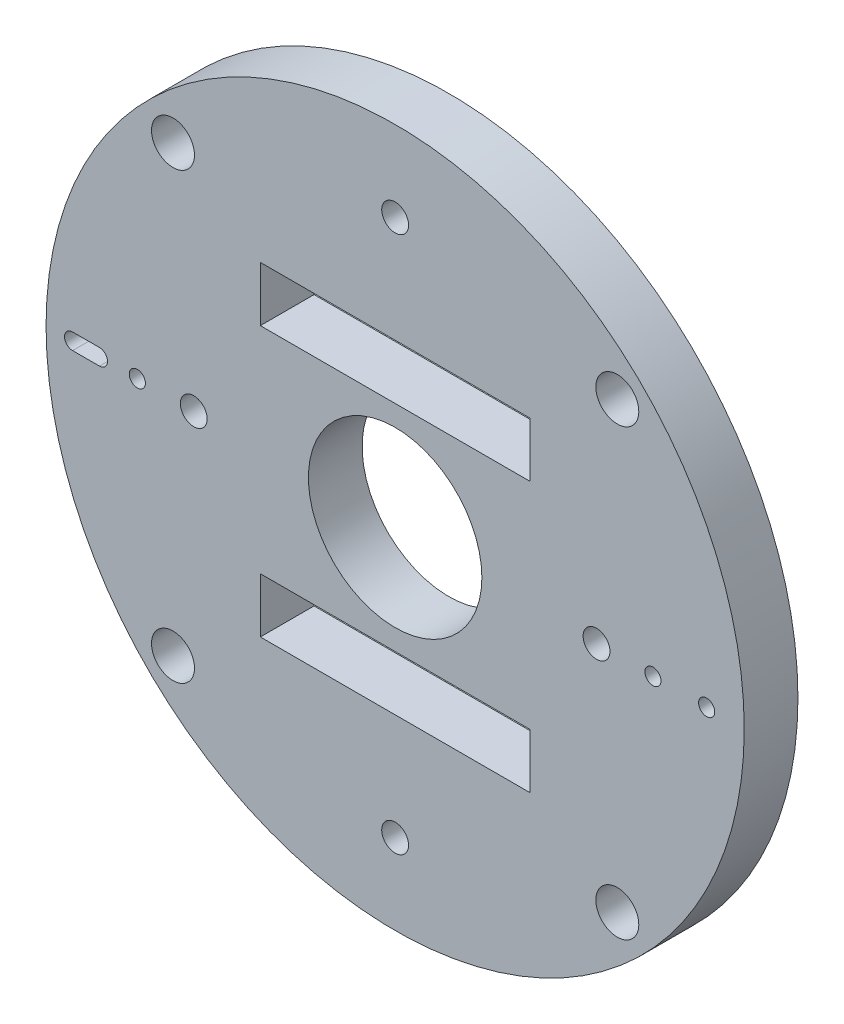
ISO-10303-21;
HEADER;
FILE_DESCRIPTION(('STEP AP214'),'2;1');
FILE_NAME('part.step','',(''),(''),'','','');
FILE_SCHEMA(('AUTOMOTIVE_DESIGN { 1 0 10303 214 1 1 1 1 }'));
ENDSEC;
DATA;
#1=APPLICATION_CONTEXT('core data for automotive mechanical design processes');
#2=APPLICATION_PROTOCOL_DEFINITION('international standard','automotive_design',2000,#1);
#3=PRODUCT_CONTEXT('',#1,'mechanical');
#4=PRODUCT('Part','Part','',(#3));
#5=PRODUCT_RELATED_PRODUCT_CATEGORY('part','',(#4));
#6=PRODUCT_DEFINITION_FORMATION('','',#4);
#7=PRODUCT_DEFINITION_CONTEXT('part definition',#1,'design');
#8=PRODUCT_DEFINITION('design','',#6,#7);
#9=PRODUCT_DEFINITION_SHAPE('','',#8);
#10=(LENGTH_UNIT() NAMED_UNIT(*) SI_UNIT(.MILLI.,.METRE.));
#11=(NAMED_UNIT(*) PLANE_ANGLE_UNIT() SI_UNIT($,.RADIAN.));
#12=(NAMED_UNIT(*) SI_UNIT($,.STERADIAN.) SOLID_ANGLE_UNIT());
#13=UNCERTAINTY_MEASURE_WITH_UNIT(LENGTH_MEASURE(1.E-05),#10,'distance_accuracy_value','');
#14=(GEOMETRIC_REPRESENTATION_CONTEXT(3) GLOBAL_UNCERTAINTY_ASSIGNED_CONTEXT((#13)) GLOBAL_UNIT_ASSIGNED_CONTEXT((#10,
#11,#12)) REPRESENTATION_CONTEXT('',''));
#15=CARTESIAN_POINT('',(0.,0.,0.));
#16=DIRECTION('',(0.,0.,1.));
#17=DIRECTION('',(1.,0.,0.));
#18=AXIS2_PLACEMENT_3D('',#15,#16,#17);
#19=CARTESIAN_POINT('',(0.,0.,10.));
#20=DIRECTION('',(0.,0.,1.));
#21=DIRECTION('',(1.,0.,0.));
#22=AXIS2_PLACEMENT_3D('',#19,#20,#21);
#23=PLANE('',#22);
#24=CARTESIAN_POINT('',(41.3657466994135,41.3657466994125,10.));
#25=DIRECTION('',(0.,0.,1.));
#26=DIRECTION('',(1.,0.,0.));
#27=AXIS2_PLACEMENT_3D('',#24,#25,#26);
#28=CIRCLE('',#27,4.00000000000001);
#29=CARTESIAN_POINT('',(45.3657466994135,41.3657466994125,10.));
#30=VERTEX_POINT('',#29);
#31=EDGE_CURVE('E168',#30,#30,#28,.T.);
#32=ORIENTED_EDGE('',*,*,#31,.F.);
#33=EDGE_LOOP('',(#32));
#34=FACE_BOUND('',#33,.T.);
#35=CARTESIAN_POINT('',(-41.3657466994132,41.3657466994128,10.));
#36=DIRECTION('',(0.,0.,1.));
#37=DIRECTION('',(1.,0.,0.));
#38=AXIS2_PLACEMENT_3D('',#35,#36,#37);
#39=CIRCLE('',#38,4.00000000000001);
#40=CARTESIAN_POINT('',(-37.3657466994132,41.3657466994128,10.));
#41=VERTEX_POINT('',#40);
#42=EDGE_CURVE('E180',#41,#41,#39,.T.);
#43=ORIENTED_EDGE('',*,*,#42,.F.);
#44=EDGE_LOOP('',(#43));
#45=FACE_BOUND('',#44,.T.);
#46=CARTESIAN_POINT('',(-48.,0.,10.));
#47=DIRECTION('',(0.,0.,1.));
#48=DIRECTION('',(1.,0.,0.));
#49=AXIS2_PLACEMENT_3D('',#46,#47,#48);
#50=CIRCLE('',#49,1.5);
#51=CARTESIAN_POINT('',(-46.5,0.,10.));
#52=VERTEX_POINT('',#51);
#53=EDGE_CURVE('E254',#52,#52,#50,.T.);
#54=ORIENTED_EDGE('',*,*,#53,.F.);
#55=EDGE_LOOP('',(#54));
#56=FACE_BOUND('',#55,.T.);
#57=CARTESIAN_POINT('',(48.,0.,10.));
#58=DIRECTION('',(0.,0.,1.));
#59=DIRECTION('',(1.,0.,0.));
#60=AXIS2_PLACEMENT_3D('',#57,#58,#59);
#61=CIRCLE('',#60,1.5);
#62=CARTESIAN_POINT('',(49.5,0.,10.));
#63=VERTEX_POINT('',#62);
#64=EDGE_CURVE('E266',#63,#63,#61,.T.);
#65=ORIENTED_EDGE('',*,*,#64,.F.);
#66=EDGE_LOOP('',(#65));
#67=FACE_BOUND('',#66,.T.);
#68=CARTESIAN_POINT('',(0.,50.,10.));
#69=DIRECTION('',(0.,0.,1.));
#70=DIRECTION('',(1.,0.,0.));
#71=AXIS2_PLACEMENT_3D('',#68,#69,#70);
#72=CIRCLE('',#71,2.5);
#73=CARTESIAN_POINT('',(2.49999999999998,50.,10.));
#74=VERTEX_POINT('',#73);
#75=EDGE_CURVE('E278',#74,#74,#72,.T.);
#76=ORIENTED_EDGE('',*,*,#75,.F.);
#77=EDGE_LOOP('',(#76));
#78=FACE_BOUND('',#77,.T.);
#79=CARTESIAN_POINT('',(-37.5,0.,10.));
#80=DIRECTION('',(0.,0.,1.));
#81=DIRECTION('',(1.,0.,0.));
#82=AXIS2_PLACEMENT_3D('',#79,#80,#81);
#83=CIRCLE('',#82,2.5);
#84=CARTESIAN_POINT('',(-35.,0.,10.));
#85=VERTEX_POINT('',#84);
#86=EDGE_CURVE('E290',#85,#85,#83,.T.);
#87=ORIENTED_EDGE('',*,*,#86,.F.);
#88=EDGE_LOOP('',(#87));
#89=FACE_BOUND('',#88,.T.);
#90=CARTESIAN_POINT('',(0.,0.,10.));
#91=DIRECTION('',(0.,0.,1.));
#92=DIRECTION('',(1.,0.,0.));
#93=AXIS2_PLACEMENT_3D('',#90,#91,#92);
#94=CIRCLE('',#93,65.);
#95=CARTESIAN_POINT('',(65.,0.,10.));
#96=VERTEX_POINT('',#95);
#97=EDGE_CURVE('E11',#96,#96,#94,.T.);
#98=ORIENTED_EDGE('',*,*,#97,.T.);
#99=EDGE_LOOP('',(#98));
#100=FACE_BOUND('',#99,.T.);
#101=CARTESIAN_POINT('',(37.5,0.,10.));
#102=DIRECTION('',(0.,0.,1.));
#103=DIRECTION('',(1.,0.,0.));
#104=AXIS2_PLACEMENT_3D('',#101,#102,#103);
#105=CIRCLE('',#104,2.5);
#106=CARTESIAN_POINT('',(40.,0.,10.));
#107=VERTEX_POINT('',#106);
#108=EDGE_CURVE('E284',#107,#107,#105,.T.);
#109=ORIENTED_EDGE('',*,*,#108,.F.);
#110=EDGE_LOOP('',(#109));
#111=FACE_BOUND('',#110,.T.);
#112=CARTESIAN_POINT('',(0.,-50.,10.));
#113=DIRECTION('',(0.,0.,1.));
#114=DIRECTION('',(1.,0.,0.));
#115=AXIS2_PLACEMENT_3D('',#112,#113,#114);
#116=CIRCLE('',#115,2.5);
#117=CARTESIAN_POINT('',(2.50000000000001,-50.,10.));
#118=VERTEX_POINT('',#117);
#119=EDGE_CURVE('E272',#118,#118,#116,.T.);
#120=ORIENTED_EDGE('',*,*,#119,.F.);
#121=EDGE_LOOP('',(#120));
#122=FACE_BOUND('',#121,.T.);
#123=CARTESIAN_POINT('',(58.,0.,10.));
#124=DIRECTION('',(0.,0.,1.));
#125=DIRECTION('',(1.,0.,0.));
#126=AXIS2_PLACEMENT_3D('',#123,#124,#125);
#127=CIRCLE('',#126,1.5);
#128=CARTESIAN_POINT('',(59.5,0.,10.));
#129=VERTEX_POINT('',#128);
#130=EDGE_CURVE('E260',#129,#129,#127,.T.);
#131=ORIENTED_EDGE('',*,*,#130,.F.);
#132=EDGE_LOOP('',(#131));
#133=FACE_BOUND('',#132,.T.);
#134=CARTESIAN_POINT('',(0.,0.,10.));
#135=DIRECTION('',(0.,0.,1.));
#136=DIRECTION('',(1.,0.,0.));
#137=AXIS2_PLACEMENT_3D('',#134,#135,#136);
#138=CIRCLE('',#137,16.15);
#139=CARTESIAN_POINT('',(16.15,0.,10.));
#140=VERTEX_POINT('',#139);
#141=EDGE_CURVE('E248',#140,#140,#138,.T.);
#142=ORIENTED_EDGE('',*,*,#141,.F.);
#143=EDGE_LOOP('',(#142));
#144=FACE_BOUND('',#143,.T.);
#145=DIRECTION('',(-1.,0.,0.));
#146=VECTOR('',#145,1.);
#147=CARTESIAN_POINT('',(-25.1,30.2,10.));
#148=LINE('',#147,#146);
#149=CARTESIAN_POINT('',(25.1,30.2,10.));
#150=VERTEX_POINT('',#149);
#151=CARTESIAN_POINT('',(-25.1,30.2,10.));
#152=VERTEX_POINT('',#151);
#153=EDGE_CURVE('E219',#150,#152,#148,.T.);
#154=ORIENTED_EDGE('',*,*,#153,.F.);
#155=DIRECTION('',(0.,1.,0.));
#156=VECTOR('',#155,1.);
#157=CARTESIAN_POINT('',(25.1,20.,10.));
#158=LINE('',#157,#156);
#159=CARTESIAN_POINT('',(25.1,20.,10.));
#160=VERTEX_POINT('',#159);
#161=EDGE_CURVE('E217',#160,#150,#158,.T.);
#162=ORIENTED_EDGE('',*,*,#161,.F.);
#163=DIRECTION('',(1.,0.,0.));
#164=VECTOR('',#163,1.);
#165=CARTESIAN_POINT('',(-25.1,20.,10.));
#166=LINE('',#165,#164);
#167=CARTESIAN_POINT('',(-25.1,20.,10.));
#168=VERTEX_POINT('',#167);
#169=EDGE_CURVE('E225',#168,#160,#166,.T.);
#170=ORIENTED_EDGE('',*,*,#169,.F.);
#171=DIRECTION('',(0.,-1.,0.));
#172=VECTOR('',#171,1.);
#173=CARTESIAN_POINT('',(-25.1,30.2,10.));
#174=LINE('',#173,#172);
#175=EDGE_CURVE('E222',#152,#168,#174,.T.);
#176=ORIENTED_EDGE('',*,*,#175,.F.);
#177=EDGE_LOOP('',(#154,#162,#170,#176));
#178=FACE_BOUND('',#177,.T.);
#179=DIRECTION('',(-1.,0.,0.));
#180=VECTOR('',#179,1.);
#181=CARTESIAN_POINT('',(-25.1,-20.,10.));
#182=LINE('',#181,#180);
#183=CARTESIAN_POINT('',(25.1,-20.,10.));
#184=VERTEX_POINT('',#183);
#185=CARTESIAN_POINT('',(-25.1,-20.,10.));
#186=VERTEX_POINT('',#185);
#187=EDGE_CURVE('E188',#184,#186,#182,.T.);
#188=ORIENTED_EDGE('',*,*,#187,.F.);
#189=DIRECTION('',(0.,1.,0.));
#190=VECTOR('',#189,1.);
#191=CARTESIAN_POINT('',(25.1,-20.,10.));
#192=LINE('',#191,#190);
#193=CARTESIAN_POINT('',(25.1,-30.2,10.));
#194=VERTEX_POINT('',#193);
#195=EDGE_CURVE('E186',#194,#184,#192,.T.);
#196=ORIENTED_EDGE('',*,*,#195,.F.);
#197=DIRECTION('',(1.,0.,0.));
#198=VECTOR('',#197,1.);
#199=CARTESIAN_POINT('',(25.1,-30.2,10.));
#200=LINE('',#199,#198);
#201=CARTESIAN_POINT('',(-25.1,-30.2,10.));
#202=VERTEX_POINT('',#201);
#203=EDGE_CURVE('E194',#202,#194,#200,.T.);
#204=ORIENTED_EDGE('',*,*,#203,.F.);
#205=DIRECTION('',(0.,-1.,0.));
#206=VECTOR('',#205,1.);
#207=CARTESIAN_POINT('',(-25.1,-30.2,10.));
#208=LINE('',#207,#206);
#209=EDGE_CURVE('E191',#186,#202,#208,.T.);
#210=ORIENTED_EDGE('',*,*,#209,.F.);
#211=EDGE_LOOP('',(#188,#196,#204,#210));
#212=FACE_BOUND('',#211,.T.);
#213=CARTESIAN_POINT('',(41.3657466994135,-41.3657466994125,10.));
#214=DIRECTION('',(0.,0.,1.));
#215=DIRECTION('',(1.,0.,0.));
#216=AXIS2_PLACEMENT_3D('',#213,#214,#215);
#217=CIRCLE('',#216,4.00000000000001);
#218=CARTESIAN_POINT('',(45.3657466994135,-41.3657466994125,10.));
#219=VERTEX_POINT('',#218);
#220=EDGE_CURVE('E174',#219,#219,#217,.T.);
#221=ORIENTED_EDGE('',*,*,#220,.F.);
#222=EDGE_LOOP('',(#221));
#223=FACE_BOUND('',#222,.T.);
#224=CARTESIAN_POINT('',(-41.3657466994132,-41.3657466994128,10.));
#225=DIRECTION('',(0.,0.,1.));
#226=DIRECTION('',(1.,0.,0.));
#227=AXIS2_PLACEMENT_3D('',#224,#225,#226);
#228=CIRCLE('',#227,4.00000000000001);
#229=CARTESIAN_POINT('',(-37.3657466994132,-41.3657466994128,10.));
#230=VERTEX_POINT('',#229);
#231=EDGE_CURVE('E162',#230,#230,#228,.T.);
#232=ORIENTED_EDGE('',*,*,#231,.F.);
#233=EDGE_LOOP('',(#232));
#234=FACE_BOUND('',#233,.T.);
#235=DIRECTION('',(-1.,0.,0.));
#236=VECTOR('',#235,1.);
#237=CARTESIAN_POINT('',(-55.0565634594027,1.5,10.));
#238=LINE('',#237,#236);
#239=CARTESIAN_POINT('',(-55.0565634594027,1.5,10.));
#240=VERTEX_POINT('',#239);
#241=CARTESIAN_POINT('',(-60.0565634594027,1.5,10.));
#242=VERTEX_POINT('',#241);
#243=EDGE_CURVE('E134',#240,#242,#238,.T.);
#244=ORIENTED_EDGE('',*,*,#243,.F.);
#245=CARTESIAN_POINT('',(-55.0565634594027,0.,10.));
#246=DIRECTION('',(0.,0.,1.));
#247=DIRECTION('',(1.,0.,0.));
#248=AXIS2_PLACEMENT_3D('',#245,#246,#247);
#249=CIRCLE('',#248,1.5);
#250=CARTESIAN_POINT('',(-55.0565634594027,-1.5,10.));
#251=VERTEX_POINT('',#250);
#252=EDGE_CURVE('E126',#251,#240,#249,.T.);
#253=ORIENTED_EDGE('',*,*,#252,.F.);
#254=DIRECTION('',(1.,0.,0.));
#255=VECTOR('',#254,1.);
#256=CARTESIAN_POINT('',(-55.0565634594027,-1.5,10.));
#257=LINE('',#256,#255);
#258=CARTESIAN_POINT('',(-60.0565634594027,-1.5,10.));
#259=VERTEX_POINT('',#258);
#260=EDGE_CURVE('E148',#259,#251,#257,.T.);
#261=ORIENTED_EDGE('',*,*,#260,.F.);
#262=CARTESIAN_POINT('',(-60.0565634594027,0.,10.));
#263=DIRECTION('',(0.,0.,1.));
#264=DIRECTION('',(1.,0.,0.));
#265=AXIS2_PLACEMENT_3D('',#262,#263,#264);
#266=CIRCLE('',#265,1.5);
#267=EDGE_CURVE('E146',#242,#259,#266,.T.);
#268=ORIENTED_EDGE('',*,*,#267,.F.);
#269=EDGE_LOOP('',(#244,#253,#261,#268));
#270=FACE_BOUND('',#269,.T.);
#271=ADVANCED_FACE('F37',(#34,#45,#56,#67,#78,#89,#100,#111,#122,#133,#144,#178,#212,#223,#234,
#270),#23,.T.);
#272=CARTESIAN_POINT('',(0.,0.,0.));
#273=DIRECTION('',(0.,0.,1.));
#274=DIRECTION('',(1.,0.,0.));
#275=AXIS2_PLACEMENT_3D('',#272,#273,#274);
#276=PLANE('',#275);
#277=CARTESIAN_POINT('',(-41.3657466994132,-41.3657466994128,0.));
#278=DIRECTION('',(0.,0.,1.));
#279=DIRECTION('',(1.,0.,0.));
#280=AXIS2_PLACEMENT_3D('',#277,#278,#279);
#281=CIRCLE('',#280,4.00000000000001);
#282=CARTESIAN_POINT('',(-37.3657466994132,-41.3657466994128,0.));
#283=VERTEX_POINT('',#282);
#284=EDGE_CURVE('E142',#283,#283,#281,.T.);
#285=ORIENTED_EDGE('',*,*,#284,.T.);
#286=EDGE_LOOP('',(#285));
#287=FACE_BOUND('',#286,.T.);
#288=CARTESIAN_POINT('',(41.3657466994135,41.3657466994125,0.));
#289=DIRECTION('',(0.,0.,1.));
#290=DIRECTION('',(1.,0.,0.));
#291=AXIS2_PLACEMENT_3D('',#288,#289,#290);
#292=CIRCLE('',#291,4.00000000000001);
#293=CARTESIAN_POINT('',(45.3657466994135,41.3657466994125,0.));
#294=VERTEX_POINT('',#293);
#295=EDGE_CURVE('E165',#294,#294,#292,.T.);
#296=ORIENTED_EDGE('',*,*,#295,.T.);
#297=EDGE_LOOP('',(#296));
#298=FACE_BOUND('',#297,.T.);
#299=CARTESIAN_POINT('',(41.3657466994135,-41.3657466994125,0.));
#300=DIRECTION('',(0.,0.,1.));
#301=DIRECTION('',(1.,0.,0.));
#302=AXIS2_PLACEMENT_3D('',#299,#300,#301);
#303=CIRCLE('',#302,4.00000000000001);
#304=CARTESIAN_POINT('',(45.3657466994135,-41.3657466994125,0.));
#305=VERTEX_POINT('',#304);
#306=EDGE_CURVE('E171',#305,#305,#303,.T.);
#307=ORIENTED_EDGE('',*,*,#306,.T.);
#308=EDGE_LOOP('',(#307));
#309=FACE_BOUND('',#308,.T.);
#310=CARTESIAN_POINT('',(-41.3657466994132,41.3657466994128,0.));
#311=DIRECTION('',(0.,0.,1.));
#312=DIRECTION('',(1.,0.,0.));
#313=AXIS2_PLACEMENT_3D('',#310,#311,#312);
#314=CIRCLE('',#313,4.00000000000001);
#315=CARTESIAN_POINT('',(-37.3657466994132,41.3657466994128,0.));
#316=VERTEX_POINT('',#315);
#317=EDGE_CURVE('E177',#316,#316,#314,.T.);
#318=ORIENTED_EDGE('',*,*,#317,.T.);
#319=EDGE_LOOP('',(#318));
#320=FACE_BOUND('',#319,.T.);
#321=DIRECTION('',(0.,1.,0.));
#322=VECTOR('',#321,1.);
#323=CARTESIAN_POINT('',(25.1,-20.,0.));
#324=LINE('',#323,#322);
#325=CARTESIAN_POINT('',(25.1,-30.2,0.));
#326=VERTEX_POINT('',#325);
#327=CARTESIAN_POINT('',(25.1,-20.,0.));
#328=VERTEX_POINT('',#327);
#329=EDGE_CURVE('E183',#326,#328,#324,.T.);
#330=ORIENTED_EDGE('',*,*,#329,.T.);
#331=DIRECTION('',(-1.,0.,0.));
#332=VECTOR('',#331,1.);
#333=CARTESIAN_POINT('',(-25.1,-20.,0.));
#334=LINE('',#333,#332);
#335=CARTESIAN_POINT('',(-25.1,-20.,0.));
#336=VERTEX_POINT('',#335);
#337=EDGE_CURVE('E199',#328,#336,#334,.T.);
#338=ORIENTED_EDGE('',*,*,#337,.T.);
#339=DIRECTION('',(0.,-1.,0.));
#340=VECTOR('',#339,1.);
#341=CARTESIAN_POINT('',(-25.1,-30.2,0.));
#342=LINE('',#341,#340);
#343=CARTESIAN_POINT('',(-25.1,-30.2,0.));
#344=VERTEX_POINT('',#343);
#345=EDGE_CURVE('E202',#336,#344,#342,.T.);
#346=ORIENTED_EDGE('',*,*,#345,.T.);
#347=DIRECTION('',(1.,0.,0.));
#348=VECTOR('',#347,1.);
#349=CARTESIAN_POINT('',(25.1,-30.2,0.));
#350=LINE('',#349,#348);
#351=EDGE_CURVE('E189',#344,#326,#350,.T.);
#352=ORIENTED_EDGE('',*,*,#351,.T.);
#353=EDGE_LOOP('',(#330,#338,#346,#352));
#354=FACE_BOUND('',#353,.T.);
#355=CARTESIAN_POINT('',(0.,0.,0.));
#356=DIRECTION('',(0.,0.,1.));
#357=DIRECTION('',(1.,0.,0.));
#358=AXIS2_PLACEMENT_3D('',#355,#356,#357);
#359=CIRCLE('',#358,16.15);
#360=CARTESIAN_POINT('',(16.15,0.,0.));
#361=VERTEX_POINT('',#360);
#362=EDGE_CURVE('E247',#361,#361,#359,.T.);
#363=ORIENTED_EDGE('',*,*,#362,.T.);
#364=EDGE_LOOP('',(#363));
#365=FACE_BOUND('',#364,.T.);
#366=CARTESIAN_POINT('',(-48.,0.,0.));
#367=DIRECTION('',(0.,0.,1.));
#368=DIRECTION('',(1.,0.,0.));
#369=AXIS2_PLACEMENT_3D('',#366,#367,#368);
#370=CIRCLE('',#369,1.5);
#371=CARTESIAN_POINT('',(-46.5,0.,0.));
#372=VERTEX_POINT('',#371);
#373=EDGE_CURVE('E251',#372,#372,#370,.T.);
#374=ORIENTED_EDGE('',*,*,#373,.T.);
#375=EDGE_LOOP('',(#374));
#376=FACE_BOUND('',#375,.T.);
#377=CARTESIAN_POINT('',(58.,0.,0.));
#378=DIRECTION('',(0.,0.,1.));
#379=DIRECTION('',(1.,0.,0.));
#380=AXIS2_PLACEMENT_3D('',#377,#378,#379);
#381=CIRCLE('',#380,1.5);
#382=CARTESIAN_POINT('',(59.5,0.,0.));
#383=VERTEX_POINT('',#382);
#384=EDGE_CURVE('E257',#383,#383,#381,.T.);
#385=ORIENTED_EDGE('',*,*,#384,.T.);
#386=EDGE_LOOP('',(#385));
#387=FACE_BOUND('',#386,.T.);
#388=CARTESIAN_POINT('',(48.,0.,0.));
#389=DIRECTION('',(0.,0.,1.));
#390=DIRECTION('',(1.,0.,0.));
#391=AXIS2_PLACEMENT_3D('',#388,#389,#390);
#392=CIRCLE('',#391,1.5);
#393=CARTESIAN_POINT('',(49.5,0.,0.));
#394=VERTEX_POINT('',#393);
#395=EDGE_CURVE('E263',#394,#394,#392,.T.);
#396=ORIENTED_EDGE('',*,*,#395,.T.);
#397=EDGE_LOOP('',(#396));
#398=FACE_BOUND('',#397,.T.);
#399=CARTESIAN_POINT('',(0.,-50.,0.));
#400=DIRECTION('',(0.,0.,1.));
#401=DIRECTION('',(1.,0.,0.));
#402=AXIS2_PLACEMENT_3D('',#399,#400,#401);
#403=CIRCLE('',#402,2.5);
#404=CARTESIAN_POINT('',(2.50000000000001,-50.,0.));
#405=VERTEX_POINT('',#404);
#406=EDGE_CURVE('E269',#405,#405,#403,.T.);
#407=ORIENTED_EDGE('',*,*,#406,.T.);
#408=EDGE_LOOP('',(#407));
#409=FACE_BOUND('',#408,.T.);
#410=CARTESIAN_POINT('',(0.,50.,0.));
#411=DIRECTION('',(0.,0.,1.));
#412=DIRECTION('',(1.,0.,0.));
#413=AXIS2_PLACEMENT_3D('',#410,#411,#412);
#414=CIRCLE('',#413,2.5);
#415=CARTESIAN_POINT('',(2.49999999999998,50.,0.));
#416=VERTEX_POINT('',#415);
#417=EDGE_CURVE('E275',#416,#416,#414,.T.);
#418=ORIENTED_EDGE('',*,*,#417,.T.);
#419=EDGE_LOOP('',(#418));
#420=FACE_BOUND('',#419,.T.);
#421=CARTESIAN_POINT('',(37.5,0.,0.));
#422=DIRECTION('',(0.,0.,1.));
#423=DIRECTION('',(1.,0.,0.));
#424=AXIS2_PLACEMENT_3D('',#421,#422,#423);
#425=CIRCLE('',#424,2.5);
#426=CARTESIAN_POINT('',(40.,0.,0.));
#427=VERTEX_POINT('',#426);
#428=EDGE_CURVE('E281',#427,#427,#425,.T.);
#429=ORIENTED_EDGE('',*,*,#428,.T.);
#430=EDGE_LOOP('',(#429));
#431=FACE_BOUND('',#430,.T.);
#432=CARTESIAN_POINT('',(-37.5,0.,0.));
#433=DIRECTION('',(0.,0.,1.));
#434=DIRECTION('',(1.,0.,0.));
#435=AXIS2_PLACEMENT_3D('',#432,#433,#434);
#436=CIRCLE('',#435,2.5);
#437=CARTESIAN_POINT('',(-35.,0.,0.));
#438=VERTEX_POINT('',#437);
#439=EDGE_CURVE('E287',#438,#438,#436,.T.);
#440=ORIENTED_EDGE('',*,*,#439,.T.);
#441=EDGE_LOOP('',(#440));
#442=FACE_BOUND('',#441,.T.);
#443=CARTESIAN_POINT('',(0.,0.,0.));
#444=DIRECTION('',(0.,0.,1.));
#445=DIRECTION('',(1.,0.,0.));
#446=AXIS2_PLACEMENT_3D('',#443,#444,#445);
#447=CIRCLE('',#446,65.);
#448=CARTESIAN_POINT('',(65.,0.,0.));
#449=VERTEX_POINT('',#448);
#450=EDGE_CURVE('E41',#449,#449,#447,.T.);
#451=ORIENTED_EDGE('',*,*,#450,.F.);
#452=EDGE_LOOP('',(#451));
#453=FACE_BOUND('',#452,.T.);
#454=DIRECTION('',(0.,1.,0.));
#455=VECTOR('',#454,1.);
#456=CARTESIAN_POINT('',(25.1,20.,0.));
#457=LINE('',#456,#455);
#458=CARTESIAN_POINT('',(25.1,20.,0.));
#459=VERTEX_POINT('',#458);
#460=CARTESIAN_POINT('',(25.1,30.2,0.));
#461=VERTEX_POINT('',#460);
#462=EDGE_CURVE('E216',#459,#461,#457,.T.);
#463=ORIENTED_EDGE('',*,*,#462,.T.);
#464=DIRECTION('',(-1.,0.,0.));
#465=VECTOR('',#464,1.);
#466=CARTESIAN_POINT('',(-25.1,30.2,0.));
#467=LINE('',#466,#465);
#468=CARTESIAN_POINT('',(-25.1,30.2,0.));
#469=VERTEX_POINT('',#468);
#470=EDGE_CURVE('E230',#461,#469,#467,.T.);
#471=ORIENTED_EDGE('',*,*,#470,.T.);
#472=DIRECTION('',(0.,-1.,0.));
#473=VECTOR('',#472,1.);
#474=CARTESIAN_POINT('',(-25.1,30.2,0.));
#475=LINE('',#474,#473);
#476=CARTESIAN_POINT('',(-25.1,20.,0.));
#477=VERTEX_POINT('',#476);
#478=EDGE_CURVE('E233',#469,#477,#475,.T.);
#479=ORIENTED_EDGE('',*,*,#478,.T.);
#480=DIRECTION('',(1.,0.,0.));
#481=VECTOR('',#480,1.);
#482=CARTESIAN_POINT('',(-25.1,20.,0.));
#483=LINE('',#482,#481);
#484=EDGE_CURVE('E220',#477,#459,#483,.T.);
#485=ORIENTED_EDGE('',*,*,#484,.T.);
#486=EDGE_LOOP('',(#463,#471,#479,#485));
#487=FACE_BOUND('',#486,.T.);
#488=CARTESIAN_POINT('',(-55.0565634594027,0.,0.));
#489=DIRECTION('',(0.,0.,1.));
#490=DIRECTION('',(1.,0.,0.));
#491=AXIS2_PLACEMENT_3D('',#488,#489,#490);
#492=CIRCLE('',#491,1.5);
#493=CARTESIAN_POINT('',(-55.0565634594027,-1.5,0.));
#494=VERTEX_POINT('',#493);
#495=CARTESIAN_POINT('',(-55.0565634594027,1.5,0.));
#496=VERTEX_POINT('',#495);
#497=EDGE_CURVE('E60',#494,#496,#492,.T.);
#498=ORIENTED_EDGE('',*,*,#497,.T.);
#499=DIRECTION('',(-1.,0.,0.));
#500=VECTOR('',#499,1.);
#501=CARTESIAN_POINT('',(-55.0565634594027,1.5,0.));
#502=LINE('',#501,#500);
#503=CARTESIAN_POINT('',(-60.0565634594027,1.5,0.));
#504=VERTEX_POINT('',#503);
#505=EDGE_CURVE('E141',#496,#504,#502,.T.);
#506=ORIENTED_EDGE('',*,*,#505,.T.);
#507=CARTESIAN_POINT('',(-60.0565634594027,0.,0.));
#508=DIRECTION('',(0.,0.,1.));
#509=DIRECTION('',(1.,0.,0.));
#510=AXIS2_PLACEMENT_3D('',#507,#508,#509);
#511=CIRCLE('',#510,1.5);
#512=CARTESIAN_POINT('',(-60.0565634594027,-1.5,0.));
#513=VERTEX_POINT('',#512);
#514=EDGE_CURVE('E154',#504,#513,#511,.T.);
#515=ORIENTED_EDGE('',*,*,#514,.T.);
#516=DIRECTION('',(1.,0.,0.));
#517=VECTOR('',#516,1.);
#518=CARTESIAN_POINT('',(-55.0565634594027,-1.5,0.));
#519=LINE('',#518,#517);
#520=EDGE_CURVE('E135',#513,#494,#519,.T.);
#521=ORIENTED_EDGE('',*,*,#520,.T.);
#522=EDGE_LOOP('',(#498,#506,#515,#521));
#523=FACE_BOUND('',#522,.T.);
#524=ADVANCED_FACE('F296',(#287,#298,#309,#320,#354,#365,#376,#387,#398,#409,#420,#431,#442,
#453,#487,#523),#276,.F.);
#525=CARTESIAN_POINT('',(0.,0.,10.));
#526=DIRECTION('',(0.,0.,-1.));
#527=DIRECTION('',(-1.,0.,0.));
#528=AXIS2_PLACEMENT_3D('',#525,#526,#527);
#529=CYLINDRICAL_SURFACE('',#528,65.);
#530=ORIENTED_EDGE('',*,*,#97,.F.);
#531=EDGE_LOOP('',(#530));
#532=FACE_BOUND('',#531,.T.);
#533=ORIENTED_EDGE('',*,*,#450,.T.);
#534=EDGE_LOOP('',(#533));
#535=FACE_BOUND('',#534,.T.);
#536=ADVANCED_FACE('F39',(#532,#535),#529,.T.);
#537=CARTESIAN_POINT('',(-37.5,0.,10.));
#538=DIRECTION('',(0.,0.,-1.));
#539=DIRECTION('',(-1.,0.,0.));
#540=AXIS2_PLACEMENT_3D('',#537,#538,#539);
#541=CYLINDRICAL_SURFACE('',#540,2.5);
#542=ORIENTED_EDGE('',*,*,#86,.T.);
#543=EDGE_LOOP('',(#542));
#544=FACE_BOUND('',#543,.T.);
#545=ORIENTED_EDGE('',*,*,#439,.F.);
#546=EDGE_LOOP('',(#545));
#547=FACE_BOUND('',#546,.T.);
#548=ADVANCED_FACE('F299',(#544,#547),#541,.F.);
#549=CARTESIAN_POINT('',(37.5,0.,10.));
#550=DIRECTION('',(0.,0.,-1.));
#551=DIRECTION('',(-1.,0.,0.));
#552=AXIS2_PLACEMENT_3D('',#549,#550,#551);
#553=CYLINDRICAL_SURFACE('',#552,2.5);
#554=ORIENTED_EDGE('',*,*,#108,.T.);
#555=EDGE_LOOP('',(#554));
#556=FACE_BOUND('',#555,.T.);
#557=ORIENTED_EDGE('',*,*,#428,.F.);
#558=EDGE_LOOP('',(#557));
#559=FACE_BOUND('',#558,.T.);
#560=ADVANCED_FACE('F301',(#556,#559),#553,.F.);
#561=CARTESIAN_POINT('',(0.,50.,10.));
#562=DIRECTION('',(0.,0.,-1.));
#563=DIRECTION('',(-1.,0.,0.));
#564=AXIS2_PLACEMENT_3D('',#561,#562,#563);
#565=CYLINDRICAL_SURFACE('',#564,2.5);
#566=ORIENTED_EDGE('',*,*,#75,.T.);
#567=EDGE_LOOP('',(#566));
#568=FACE_BOUND('',#567,.T.);
#569=ORIENTED_EDGE('',*,*,#417,.F.);
#570=EDGE_LOOP('',(#569));
#571=FACE_BOUND('',#570,.T.);
#572=ADVANCED_FACE('F308',(#568,#571),#565,.F.);
#573=CARTESIAN_POINT('',(0.,-50.,10.));
#574=DIRECTION('',(0.,0.,-1.));
#575=DIRECTION('',(-1.,0.,0.));
#576=AXIS2_PLACEMENT_3D('',#573,#574,#575);
#577=CYLINDRICAL_SURFACE('',#576,2.5);
#578=ORIENTED_EDGE('',*,*,#119,.T.);
#579=EDGE_LOOP('',(#578));
#580=FACE_BOUND('',#579,.T.);
#581=ORIENTED_EDGE('',*,*,#406,.F.);
#582=EDGE_LOOP('',(#581));
#583=FACE_BOUND('',#582,.T.);
#584=ADVANCED_FACE('F383',(#580,#583),#577,.F.);
#585=CARTESIAN_POINT('',(48.,0.,10.));
#586=DIRECTION('',(0.,0.,-1.));
#587=DIRECTION('',(-1.,0.,0.));
#588=AXIS2_PLACEMENT_3D('',#585,#586,#587);
#589=CYLINDRICAL_SURFACE('',#588,1.5);
#590=ORIENTED_EDGE('',*,*,#64,.T.);
#591=EDGE_LOOP('',(#590));
#592=FACE_BOUND('',#591,.T.);
#593=ORIENTED_EDGE('',*,*,#395,.F.);
#594=EDGE_LOOP('',(#593));
#595=FACE_BOUND('',#594,.T.);
#596=ADVANCED_FACE('F389',(#592,#595),#589,.F.);
#597=CARTESIAN_POINT('',(58.,0.,10.));
#598=DIRECTION('',(0.,0.,-1.));
#599=DIRECTION('',(-1.,0.,0.));
#600=AXIS2_PLACEMENT_3D('',#597,#598,#599);
#601=CYLINDRICAL_SURFACE('',#600,1.5);
#602=ORIENTED_EDGE('',*,*,#130,.T.);
#603=EDGE_LOOP('',(#602));
#604=FACE_BOUND('',#603,.T.);
#605=ORIENTED_EDGE('',*,*,#384,.F.);
#606=EDGE_LOOP('',(#605));
#607=FACE_BOUND('',#606,.T.);
#608=ADVANCED_FACE('F395',(#604,#607),#601,.F.);
#609=CARTESIAN_POINT('',(-48.,0.,10.));
#610=DIRECTION('',(0.,0.,-1.));
#611=DIRECTION('',(-1.,0.,0.));
#612=AXIS2_PLACEMENT_3D('',#609,#610,#611);
#613=CYLINDRICAL_SURFACE('',#612,1.5);
#614=ORIENTED_EDGE('',*,*,#53,.T.);
#615=EDGE_LOOP('',(#614));
#616=FACE_BOUND('',#615,.T.);
#617=ORIENTED_EDGE('',*,*,#373,.F.);
#618=EDGE_LOOP('',(#617));
#619=FACE_BOUND('',#618,.T.);
#620=ADVANCED_FACE('F399',(#616,#619),#613,.F.);
#621=CARTESIAN_POINT('',(0.,0.,10.));
#622=DIRECTION('',(0.,0.,-1.));
#623=DIRECTION('',(-1.,0.,0.));
#624=AXIS2_PLACEMENT_3D('',#621,#622,#623);
#625=CYLINDRICAL_SURFACE('',#624,16.15);
#626=ORIENTED_EDGE('',*,*,#141,.T.);
#627=EDGE_LOOP('',(#626));
#628=FACE_BOUND('',#627,.T.);
#629=ORIENTED_EDGE('',*,*,#362,.F.);
#630=EDGE_LOOP('',(#629));
#631=FACE_BOUND('',#630,.T.);
#632=ADVANCED_FACE('F403',(#628,#631),#625,.F.);
#633=CARTESIAN_POINT('',(25.1,20.,10.));
#634=DIRECTION('',(-1.,0.,0.));
#635=DIRECTION('',(0.,0.,1.));
#636=AXIS2_PLACEMENT_3D('',#633,#634,#635);
#637=PLANE('',#636);
#638=ORIENTED_EDGE('',*,*,#462,.F.);
#639=DIRECTION('',(0.,0.,-1.));
#640=VECTOR('',#639,1.);
#641=CARTESIAN_POINT('',(25.1,20.,10.));
#642=LINE('',#641,#640);
#643=EDGE_CURVE('E227',#160,#459,#642,.T.);
#644=ORIENTED_EDGE('',*,*,#643,.F.);
#645=ORIENTED_EDGE('',*,*,#161,.T.);
#646=DIRECTION('',(0.,0.,-1.));
#647=VECTOR('',#646,1.);
#648=CARTESIAN_POINT('',(25.1,30.2,10.));
#649=LINE('',#648,#647);
#650=EDGE_CURVE('E244',#150,#461,#649,.T.);
#651=ORIENTED_EDGE('',*,*,#650,.T.);
#652=EDGE_LOOP('',(#638,#644,#645,#651));
#653=FACE_BOUND('',#652,.T.);
#654=ADVANCED_FACE('F407',(#653),#637,.T.);
#655=CARTESIAN_POINT('',(-25.1,30.2,10.));
#656=DIRECTION('',(0.,-1.,0.));
#657=DIRECTION('',(0.,0.,-1.));
#658=AXIS2_PLACEMENT_3D('',#655,#656,#657);
#659=PLANE('',#658);
#660=ORIENTED_EDGE('',*,*,#470,.F.);
#661=ORIENTED_EDGE('',*,*,#650,.F.);
#662=ORIENTED_EDGE('',*,*,#153,.T.);
#663=DIRECTION('',(0.,0.,-1.));
#664=VECTOR('',#663,1.);
#665=CARTESIAN_POINT('',(-25.1,30.2,10.));
#666=LINE('',#665,#664);
#667=EDGE_CURVE('E242',#152,#469,#666,.T.);
#668=ORIENTED_EDGE('',*,*,#667,.T.);
#669=EDGE_LOOP('',(#660,#661,#662,#668));
#670=FACE_BOUND('',#669,.T.);
#671=ADVANCED_FACE('F411',(#670),#659,.T.);
#672=CARTESIAN_POINT('',(-25.1,30.2,10.));
#673=DIRECTION('',(1.,0.,0.));
#674=DIRECTION('',(0.,0.,-1.));
#675=AXIS2_PLACEMENT_3D('',#672,#673,#674);
#676=PLANE('',#675);
#677=ORIENTED_EDGE('',*,*,#478,.F.);
#678=ORIENTED_EDGE('',*,*,#667,.F.);
#679=ORIENTED_EDGE('',*,*,#175,.T.);
#680=DIRECTION('',(0.,0.,-1.));
#681=VECTOR('',#680,1.);
#682=CARTESIAN_POINT('',(-25.1,20.,10.));
#683=LINE('',#682,#681);
#684=EDGE_CURVE('E240',#168,#477,#683,.T.);
#685=ORIENTED_EDGE('',*,*,#684,.T.);
#686=EDGE_LOOP('',(#677,#678,#679,#685));
#687=FACE_BOUND('',#686,.T.);
#688=ADVANCED_FACE('F415',(#687),#676,.T.);
#689=CARTESIAN_POINT('',(-25.1,20.,10.));
#690=DIRECTION('',(0.,1.,0.));
#691=DIRECTION('',(0.,0.,1.));
#692=AXIS2_PLACEMENT_3D('',#689,#690,#691);
#693=PLANE('',#692);
#694=ORIENTED_EDGE('',*,*,#484,.F.);
#695=ORIENTED_EDGE('',*,*,#684,.F.);
#696=ORIENTED_EDGE('',*,*,#169,.T.);
#697=ORIENTED_EDGE('',*,*,#643,.T.);
#698=EDGE_LOOP('',(#694,#695,#696,#697));
#699=FACE_BOUND('',#698,.T.);
#700=ADVANCED_FACE('F419',(#699),#693,.T.);
#701=CARTESIAN_POINT('',(25.1,-20.,10.));
#702=DIRECTION('',(-1.,0.,0.));
#703=DIRECTION('',(0.,0.,1.));
#704=AXIS2_PLACEMENT_3D('',#701,#702,#703);
#705=PLANE('',#704);
#706=ORIENTED_EDGE('',*,*,#329,.F.);
#707=DIRECTION('',(0.,0.,-1.));
#708=VECTOR('',#707,1.);
#709=CARTESIAN_POINT('',(25.1,-30.2,10.));
#710=LINE('',#709,#708);
#711=EDGE_CURVE('E196',#194,#326,#710,.T.);
#712=ORIENTED_EDGE('',*,*,#711,.F.);
#713=ORIENTED_EDGE('',*,*,#195,.T.);
#714=DIRECTION('',(0.,0.,-1.));
#715=VECTOR('',#714,1.);
#716=CARTESIAN_POINT('',(25.1,-20.,10.));
#717=LINE('',#716,#715);
#718=EDGE_CURVE('E213',#184,#328,#717,.T.);
#719=ORIENTED_EDGE('',*,*,#718,.T.);
#720=EDGE_LOOP('',(#706,#712,#713,#719));
#721=FACE_BOUND('',#720,.T.);
#722=ADVANCED_FACE('F423',(#721),#705,.T.);
#723=CARTESIAN_POINT('',(-25.1,-20.,10.));
#724=DIRECTION('',(0.,-1.,0.));
#725=DIRECTION('',(0.,0.,-1.));
#726=AXIS2_PLACEMENT_3D('',#723,#724,#725);
#727=PLANE('',#726);
#728=ORIENTED_EDGE('',*,*,#337,.F.);
#729=ORIENTED_EDGE('',*,*,#718,.F.);
#730=ORIENTED_EDGE('',*,*,#187,.T.);
#731=DIRECTION('',(0.,0.,-1.));
#732=VECTOR('',#731,1.);
#733=CARTESIAN_POINT('',(-25.1,-20.,10.));
#734=LINE('',#733,#732);
#735=EDGE_CURVE('E211',#186,#336,#734,.T.);
#736=ORIENTED_EDGE('',*,*,#735,.T.);
#737=EDGE_LOOP('',(#728,#729,#730,#736));
#738=FACE_BOUND('',#737,.T.);
#739=ADVANCED_FACE('F427',(#738),#727,.T.);
#740=CARTESIAN_POINT('',(-25.1,-30.2,10.));
#741=DIRECTION('',(1.,0.,0.));
#742=DIRECTION('',(0.,0.,-1.));
#743=AXIS2_PLACEMENT_3D('',#740,#741,#742);
#744=PLANE('',#743);
#745=ORIENTED_EDGE('',*,*,#345,.F.);
#746=ORIENTED_EDGE('',*,*,#735,.F.);
#747=ORIENTED_EDGE('',*,*,#209,.T.);
#748=DIRECTION('',(0.,0.,-1.));
#749=VECTOR('',#748,1.);
#750=CARTESIAN_POINT('',(-25.1,-30.2,10.));
#751=LINE('',#750,#749);
#752=EDGE_CURVE('E209',#202,#344,#751,.T.);
#753=ORIENTED_EDGE('',*,*,#752,.T.);
#754=EDGE_LOOP('',(#745,#746,#747,#753));
#755=FACE_BOUND('',#754,.T.);
#756=ADVANCED_FACE('F431',(#755),#744,.T.);
#757=CARTESIAN_POINT('',(25.1,-30.2,10.));
#758=DIRECTION('',(0.,1.,0.));
#759=DIRECTION('',(-1.,0.,0.));
#760=AXIS2_PLACEMENT_3D('',#757,#758,#759);
#761=PLANE('',#760);
#762=ORIENTED_EDGE('',*,*,#351,.F.);
#763=ORIENTED_EDGE('',*,*,#752,.F.);
#764=ORIENTED_EDGE('',*,*,#203,.T.);
#765=ORIENTED_EDGE('',*,*,#711,.T.);
#766=EDGE_LOOP('',(#762,#763,#764,#765));
#767=FACE_BOUND('',#766,.T.);
#768=ADVANCED_FACE('F435',(#767),#761,.T.);
#769=CARTESIAN_POINT('',(-41.3657466994132,41.3657466994128,10.));
#770=DIRECTION('',(0.,0.,-1.));
#771=DIRECTION('',(-1.,0.,0.));
#772=AXIS2_PLACEMENT_3D('',#769,#770,#771);
#773=CYLINDRICAL_SURFACE('',#772,4.00000000000001);
#774=ORIENTED_EDGE('',*,*,#42,.T.);
#775=EDGE_LOOP('',(#774));
#776=FACE_BOUND('',#775,.T.);
#777=ORIENTED_EDGE('',*,*,#317,.F.);
#778=EDGE_LOOP('',(#777));
#779=FACE_BOUND('',#778,.T.);
#780=ADVANCED_FACE('F439',(#776,#779),#773,.F.);
#781=CARTESIAN_POINT('',(41.3657466994135,-41.3657466994125,10.));
#782=DIRECTION('',(0.,0.,-1.));
#783=DIRECTION('',(-1.,0.,0.));
#784=AXIS2_PLACEMENT_3D('',#781,#782,#783);
#785=CYLINDRICAL_SURFACE('',#784,4.00000000000001);
#786=ORIENTED_EDGE('',*,*,#220,.T.);
#787=EDGE_LOOP('',(#786));
#788=FACE_BOUND('',#787,.T.);
#789=ORIENTED_EDGE('',*,*,#306,.F.);
#790=EDGE_LOOP('',(#789));
#791=FACE_BOUND('',#790,.T.);
#792=ADVANCED_FACE('F443',(#788,#791),#785,.F.);
#793=CARTESIAN_POINT('',(41.3657466994135,41.3657466994125,10.));
#794=DIRECTION('',(0.,0.,-1.));
#795=DIRECTION('',(-1.,0.,0.));
#796=AXIS2_PLACEMENT_3D('',#793,#794,#795);
#797=CYLINDRICAL_SURFACE('',#796,4.00000000000001);
#798=ORIENTED_EDGE('',*,*,#31,.T.);
#799=EDGE_LOOP('',(#798));
#800=FACE_BOUND('',#799,.T.);
#801=ORIENTED_EDGE('',*,*,#295,.F.);
#802=EDGE_LOOP('',(#801));
#803=FACE_BOUND('',#802,.T.);
#804=ADVANCED_FACE('F356',(#800,#803),#797,.F.);
#805=CARTESIAN_POINT('',(-41.3657466994132,-41.3657466994128,10.));
#806=DIRECTION('',(0.,0.,-1.));
#807=DIRECTION('',(-1.,0.,0.));
#808=AXIS2_PLACEMENT_3D('',#805,#806,#807);
#809=CYLINDRICAL_SURFACE('',#808,4.00000000000001);
#810=ORIENTED_EDGE('',*,*,#231,.T.);
#811=EDGE_LOOP('',(#810));
#812=FACE_BOUND('',#811,.T.);
#813=ORIENTED_EDGE('',*,*,#284,.F.);
#814=EDGE_LOOP('',(#813));
#815=FACE_BOUND('',#814,.T.);
#816=ADVANCED_FACE('F353',(#812,#815),#809,.F.);
#817=CARTESIAN_POINT('',(-55.0565634594027,0.,10.));
#818=DIRECTION('',(0.,0.,-1.));
#819=DIRECTION('',(-1.,0.,0.));
#820=AXIS2_PLACEMENT_3D('',#817,#818,#819);
#821=CYLINDRICAL_SURFACE('',#820,1.5);
#822=ORIENTED_EDGE('',*,*,#497,.F.);
#823=DIRECTION('',(0.,0.,-1.));
#824=VECTOR('',#823,1.);
#825=CARTESIAN_POINT('',(-55.0565634594027,-1.5,10.));
#826=LINE('',#825,#824);
#827=EDGE_CURVE('E130',#251,#494,#826,.T.);
#828=ORIENTED_EDGE('',*,*,#827,.F.);
#829=ORIENTED_EDGE('',*,*,#252,.T.);
#830=DIRECTION('',(0.,0.,-1.));
#831=VECTOR('',#830,1.);
#832=CARTESIAN_POINT('',(-55.0565634594027,1.5,10.));
#833=LINE('',#832,#831);
#834=EDGE_CURVE('E129',#240,#496,#833,.T.);
#835=ORIENTED_EDGE('',*,*,#834,.T.);
#836=EDGE_LOOP('',(#822,#828,#829,#835));
#837=FACE_BOUND('',#836,.T.);
#838=ADVANCED_FACE('F128',(#837),#821,.F.);
#839=CARTESIAN_POINT('',(-55.0565634594027,1.5,10.));
#840=DIRECTION('',(0.,-1.,0.));
#841=DIRECTION('',(1.,0.,0.));
#842=AXIS2_PLACEMENT_3D('',#839,#840,#841);
#843=PLANE('',#842);
#844=ORIENTED_EDGE('',*,*,#505,.F.);
#845=ORIENTED_EDGE('',*,*,#834,.F.);
#846=ORIENTED_EDGE('',*,*,#243,.T.);
#847=DIRECTION('',(0.,0.,-1.));
#848=VECTOR('',#847,1.);
#849=CARTESIAN_POINT('',(-60.0565634594027,1.5,10.));
#850=LINE('',#849,#848);
#851=EDGE_CURVE('E143',#242,#504,#850,.T.);
#852=ORIENTED_EDGE('',*,*,#851,.T.);
#853=EDGE_LOOP('',(#844,#845,#846,#852));
#854=FACE_BOUND('',#853,.T.);
#855=ADVANCED_FACE('F138',(#854),#843,.T.);
#856=CARTESIAN_POINT('',(-60.0565634594027,0.,10.));
#857=DIRECTION('',(0.,0.,-1.));
#858=DIRECTION('',(-1.,0.,0.));
#859=AXIS2_PLACEMENT_3D('',#856,#857,#858);
#860=CYLINDRICAL_SURFACE('',#859,1.5);
#861=ORIENTED_EDGE('',*,*,#514,.F.);
#862=ORIENTED_EDGE('',*,*,#851,.F.);
#863=ORIENTED_EDGE('',*,*,#267,.T.);
#864=DIRECTION('',(0.,0.,-1.));
#865=VECTOR('',#864,1.);
#866=CARTESIAN_POINT('',(-60.0565634594027,-1.5,10.));
#867=LINE('',#866,#865);
#868=EDGE_CURVE('E52',#259,#513,#867,.T.);
#869=ORIENTED_EDGE('',*,*,#868,.T.);
#870=EDGE_LOOP('',(#861,#862,#863,#869));
#871=FACE_BOUND('',#870,.T.);
#872=ADVANCED_FACE('F455',(#871),#860,.F.);
#873=CARTESIAN_POINT('',(-55.0565634594027,-1.5,10.));
#874=DIRECTION('',(0.,1.,0.));
#875=DIRECTION('',(-1.,0.,0.));
#876=AXIS2_PLACEMENT_3D('',#873,#874,#875);
#877=PLANE('',#876);
#878=ORIENTED_EDGE('',*,*,#520,.F.);
#879=ORIENTED_EDGE('',*,*,#868,.F.);
#880=ORIENTED_EDGE('',*,*,#260,.T.);
#881=ORIENTED_EDGE('',*,*,#827,.T.);
#882=EDGE_LOOP('',(#878,#879,#880,#881));
#883=FACE_BOUND('',#882,.T.);
#884=ADVANCED_FACE('F458',(#883),#877,.T.);
#885=CLOSED_SHELL('',(#271,#524,#536,#548,#560,#572,#584,#596,#608,#620,#632,#654,#671,#688,
#700,#722,#739,#756,#768,#780,#792,#804,#816,#838,#855,#872,#884));
#886=MANIFOLD_SOLID_BREP('B2',#885);
#887=ADVANCED_BREP_SHAPE_REPRESENTATION('',(#18,#886),#14);
#888=SHAPE_DEFINITION_REPRESENTATION(#9,#887);
ENDSEC;
END-ISO-10303-21;
